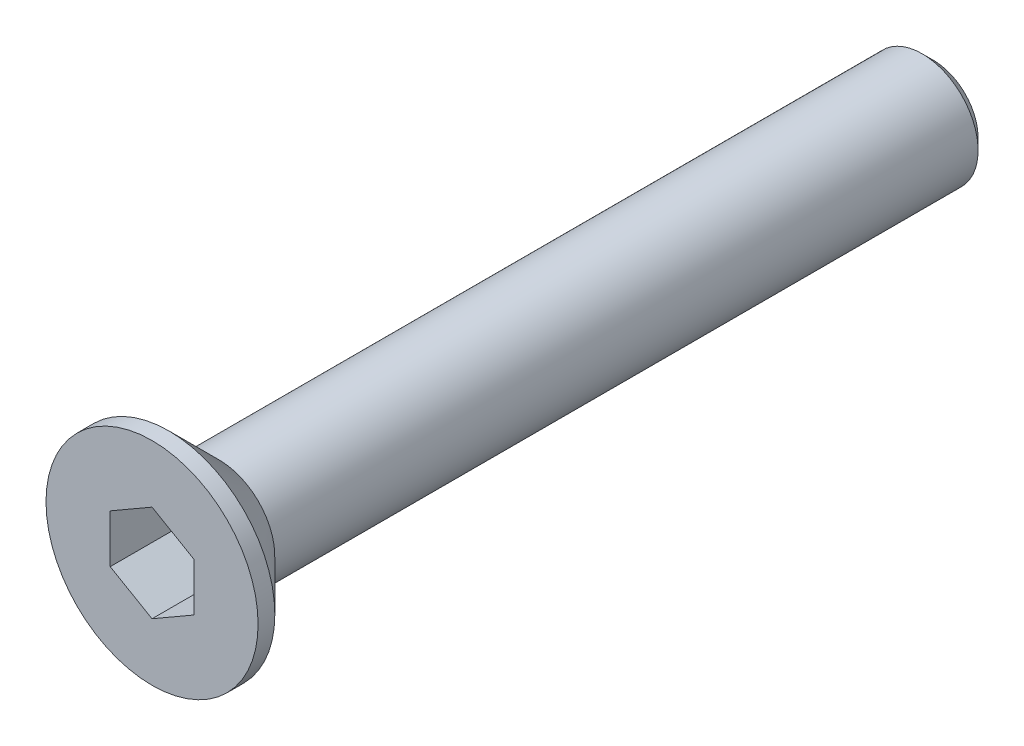
ISO-10303-21;
HEADER;
FILE_DESCRIPTION(('STEP AP214'),'2;1');
FILE_NAME('part.step','',(''),(''),'','','');
FILE_SCHEMA(('AUTOMOTIVE_DESIGN { 1 0 10303 214 1 1 1 1 }'));
ENDSEC;
DATA;
#1=APPLICATION_CONTEXT('core data for automotive mechanical design processes');
#2=APPLICATION_PROTOCOL_DEFINITION('international standard','automotive_design',2000,#1);
#3=PRODUCT_CONTEXT('',#1,'mechanical');
#4=PRODUCT('Part','Part','',(#3));
#5=PRODUCT_RELATED_PRODUCT_CATEGORY('part','',(#4));
#6=PRODUCT_DEFINITION_FORMATION('','',#4);
#7=PRODUCT_DEFINITION_CONTEXT('part definition',#1,'design');
#8=PRODUCT_DEFINITION('design','',#6,#7);
#9=PRODUCT_DEFINITION_SHAPE('','',#8);
#10=(LENGTH_UNIT() NAMED_UNIT(*) SI_UNIT(.MILLI.,.METRE.));
#11=(NAMED_UNIT(*) PLANE_ANGLE_UNIT() SI_UNIT($,.RADIAN.));
#12=(NAMED_UNIT(*) SI_UNIT($,.STERADIAN.) SOLID_ANGLE_UNIT());
#13=UNCERTAINTY_MEASURE_WITH_UNIT(LENGTH_MEASURE(1.E-05),#10,'distance_accuracy_value','');
#14=(GEOMETRIC_REPRESENTATION_CONTEXT(3) GLOBAL_UNCERTAINTY_ASSIGNED_CONTEXT((#13)) GLOBAL_UNIT_ASSIGNED_CONTEXT((#10,
#11,#12)) REPRESENTATION_CONTEXT('',''));
#15=CARTESIAN_POINT('',(0.,0.,0.));
#16=DIRECTION('',(0.,0.,1.));
#17=DIRECTION('',(1.,0.,0.));
#18=AXIS2_PLACEMENT_3D('',#15,#16,#17);
#19=CARTESIAN_POINT('',(0.,0.,-7.));
#20=DIRECTION('',(0.,0.,-1.));
#21=DIRECTION('',(-1.,0.,0.));
#22=AXIS2_PLACEMENT_3D('',#19,#20,#21);
#23=CYLINDRICAL_SURFACE('',#22,1.9);
#24=CARTESIAN_POINT('',(0.,0.,7.));
#25=DIRECTION('',(0.,0.,-1.));
#26=DIRECTION('',(-1.,0.,0.));
#27=AXIS2_PLACEMENT_3D('',#24,#25,#26);
#28=CIRCLE('',#27,1.9);
#29=CARTESIAN_POINT('',(-1.9,0.,7.));
#30=VERTEX_POINT('',#29);
#31=EDGE_CURVE('E140',#30,#30,#28,.T.);
#32=ORIENTED_EDGE('',*,*,#31,.T.);
#33=EDGE_LOOP('',(#32));
#34=FACE_BOUND('',#33,.T.);
#35=CARTESIAN_POINT('',(0.,0.,6.7));
#36=DIRECTION('',(0.,0.,-1.));
#37=DIRECTION('',(-1.,0.,0.));
#38=AXIS2_PLACEMENT_3D('',#35,#36,#37);
#39=CIRCLE('',#38,1.9);
#40=CARTESIAN_POINT('',(-1.9,0.,6.7));
#41=VERTEX_POINT('',#40);
#42=EDGE_CURVE('E151',#41,#41,#39,.T.);
#43=ORIENTED_EDGE('',*,*,#42,.F.);
#44=EDGE_LOOP('',(#43));
#45=FACE_BOUND('',#44,.T.);
#46=ADVANCED_FACE('F37',(#34,#45),#23,.T.);
#47=CARTESIAN_POINT('',(0.,0.,5.8));
#48=DIRECTION('',(0.,0.,1.));
#49=DIRECTION('',(1.,0.,0.));
#50=AXIS2_PLACEMENT_3D('',#47,#48,#49);
#51=CONICAL_SURFACE('',#50,0.999999999999999,0.78539816339745);
#52=ORIENTED_EDGE('',*,*,#42,.T.);
#53=EDGE_LOOP('',(#52));
#54=FACE_BOUND('',#53,.T.);
#55=CARTESIAN_POINT('',(0.,0.,5.8));
#56=DIRECTION('',(0.,0.,-1.));
#57=DIRECTION('',(-1.,0.,0.));
#58=AXIS2_PLACEMENT_3D('',#55,#56,#57);
#59=CIRCLE('',#58,0.999999999999999);
#60=CARTESIAN_POINT('',(-0.999999999999999,0.,5.8));
#61=VERTEX_POINT('',#60);
#62=EDGE_CURVE('E148',#61,#61,#59,.T.);
#63=ORIENTED_EDGE('',*,*,#62,.F.);
#64=EDGE_LOOP('',(#63));
#65=FACE_BOUND('',#64,.T.);
#66=ADVANCED_FACE('F167',(#54,#65),#51,.T.);
#67=CARTESIAN_POINT('',(0.,0.,-7.));
#68=DIRECTION('',(0.,0.,-1.));
#69=DIRECTION('',(-1.,0.,0.));
#70=AXIS2_PLACEMENT_3D('',#67,#68,#69);
#71=CYLINDRICAL_SURFACE('',#70,0.999999999999999);
#72=CARTESIAN_POINT('',(0.,0.,-6.79999999999999));
#73=DIRECTION('',(0.,0.,-1.));
#74=DIRECTION('',(-1.,0.,0.));
#75=AXIS2_PLACEMENT_3D('',#72,#73,#74);
#76=CIRCLE('',#75,0.999999999999999);
#77=CARTESIAN_POINT('',(-0.999999999999999,0.,-6.79999999999999));
#78=VERTEX_POINT('',#77);
#79=EDGE_CURVE('E11',#78,#78,#76,.F.);
#80=ORIENTED_EDGE('',*,*,#79,.T.);
#81=EDGE_LOOP('',(#80));
#82=FACE_BOUND('',#81,.T.);
#83=ORIENTED_EDGE('',*,*,#62,.T.);
#84=EDGE_LOOP('',(#83));
#85=FACE_BOUND('',#84,.T.);
#86=ADVANCED_FACE('F172',(#82,#85),#71,.T.);
#87=CARTESIAN_POINT('',(0.,0.999999999999999,-7.));
#88=DIRECTION('',(0.,0.,-1.));
#89=DIRECTION('',(-1.,0.,0.));
#90=AXIS2_PLACEMENT_3D('',#87,#88,#89);
#91=PLANE('',#90);
#92=CARTESIAN_POINT('',(0.,0.,-7.));
#93=DIRECTION('',(0.,0.,-1.));
#94=DIRECTION('',(-1.,0.,0.));
#95=AXIS2_PLACEMENT_3D('',#92,#93,#94);
#96=CIRCLE('',#95,0.799999999999993);
#97=CARTESIAN_POINT('',(-0.799999999999993,0.,-7.));
#98=VERTEX_POINT('',#97);
#99=EDGE_CURVE('E46',#98,#98,#96,.T.);
#100=ORIENTED_EDGE('',*,*,#99,.T.);
#101=EDGE_LOOP('',(#100));
#102=FACE_BOUND('',#101,.T.);
#103=ADVANCED_FACE('F156',(#102),#91,.T.);
#104=CARTESIAN_POINT('',(0.,0.,7.));
#105=DIRECTION('',(0.,0.,1.));
#106=DIRECTION('',(1.,0.,0.));
#107=AXIS2_PLACEMENT_3D('',#104,#105,#106);
#108=PLANE('',#107);
#109=DIRECTION('',(-0.866025403784439,0.5,0.));
#110=VECTOR('',#109,1.);
#111=CARTESIAN_POINT('',(0.75,0.43301270189222,7.));
#112=LINE('',#111,#110);
#113=CARTESIAN_POINT('',(0.75,0.43301270189222,7.));
#114=VERTEX_POINT('',#113);
#115=CARTESIAN_POINT('',(0.,0.866025403784439,7.));
#116=VERTEX_POINT('',#115);
#117=EDGE_CURVE('E53',#114,#116,#112,.T.);
#118=ORIENTED_EDGE('',*,*,#117,.F.);
#119=DIRECTION('',(0.,1.,0.));
#120=VECTOR('',#119,1.);
#121=CARTESIAN_POINT('',(0.75,-0.43301270189222,7.));
#122=LINE('',#121,#120);
#123=CARTESIAN_POINT('',(0.75,-0.43301270189222,7.));
#124=VERTEX_POINT('',#123);
#125=EDGE_CURVE('E136',#124,#114,#122,.T.);
#126=ORIENTED_EDGE('',*,*,#125,.F.);
#127=DIRECTION('',(0.866025403784439,0.5,0.));
#128=VECTOR('',#127,1.);
#129=CARTESIAN_POINT('',(0.,-0.866025403784439,7.));
#130=LINE('',#129,#128);
#131=CARTESIAN_POINT('',(0.,-0.866025403784439,7.));
#132=VERTEX_POINT('',#131);
#133=EDGE_CURVE('E134',#132,#124,#130,.T.);
#134=ORIENTED_EDGE('',*,*,#133,.F.);
#135=DIRECTION('',(0.866025403784439,-0.5,0.));
#136=VECTOR('',#135,1.);
#137=CARTESIAN_POINT('',(-0.75,-0.433012701892219,7.));
#138=LINE('',#137,#136);
#139=CARTESIAN_POINT('',(-0.75,-0.433012701892219,7.));
#140=VERTEX_POINT('',#139);
#141=EDGE_CURVE('E101',#140,#132,#138,.T.);
#142=ORIENTED_EDGE('',*,*,#141,.F.);
#143=DIRECTION('',(0.,-1.,0.));
#144=VECTOR('',#143,1.);
#145=CARTESIAN_POINT('',(-0.75,0.43301270189222,7.));
#146=LINE('',#145,#144);
#147=CARTESIAN_POINT('',(-0.75,0.43301270189222,7.));
#148=VERTEX_POINT('',#147);
#149=EDGE_CURVE('E130',#148,#140,#146,.T.);
#150=ORIENTED_EDGE('',*,*,#149,.F.);
#151=DIRECTION('',(-0.866025403784439,-0.5,0.));
#152=VECTOR('',#151,1.);
#153=CARTESIAN_POINT('',(0.,0.866025403784439,7.));
#154=LINE('',#153,#152);
#155=EDGE_CURVE('E127',#116,#148,#154,.T.);
#156=ORIENTED_EDGE('',*,*,#155,.F.);
#157=EDGE_LOOP('',(#118,#126,#134,#142,#150,#156));
#158=FACE_BOUND('',#157,.T.);
#159=ORIENTED_EDGE('',*,*,#31,.F.);
#160=EDGE_LOOP('',(#159));
#161=FACE_BOUND('',#160,.T.);
#162=ADVANCED_FACE('F182',(#158,#161),#108,.T.);
#163=CARTESIAN_POINT('',(0.75,0.43301270189222,5.5));
#164=DIRECTION('',(0.5,0.866025403784439,0.));
#165=DIRECTION('',(-0.866025403784439,0.5,0.));
#166=AXIS2_PLACEMENT_3D('',#163,#164,#165);
#167=PLANE('',#166);
#168=ORIENTED_EDGE('',*,*,#117,.T.);
#169=DIRECTION('',(0.,0.,1.));
#170=VECTOR('',#169,1.);
#171=CARTESIAN_POINT('',(0.,0.866025403784439,5.5));
#172=LINE('',#171,#170);
#173=CARTESIAN_POINT('',(0.,0.866025403784439,5.5));
#174=VERTEX_POINT('',#173);
#175=EDGE_CURVE('E83',#174,#116,#172,.T.);
#176=ORIENTED_EDGE('',*,*,#175,.F.);
#177=DIRECTION('',(-0.866025403784439,0.5,0.));
#178=VECTOR('',#177,1.);
#179=CARTESIAN_POINT('',(0.75,0.43301270189222,5.5));
#180=LINE('',#179,#178);
#181=CARTESIAN_POINT('',(0.75,0.43301270189222,5.5));
#182=VERTEX_POINT('',#181);
#183=EDGE_CURVE('E138',#182,#174,#180,.T.);
#184=ORIENTED_EDGE('',*,*,#183,.F.);
#185=DIRECTION('',(0.,0.,1.));
#186=VECTOR('',#185,1.);
#187=CARTESIAN_POINT('',(0.75,0.43301270189222,5.5));
#188=LINE('',#187,#186);
#189=EDGE_CURVE('E61',#182,#114,#188,.T.);
#190=ORIENTED_EDGE('',*,*,#189,.T.);
#191=EDGE_LOOP('',(#168,#176,#184,#190));
#192=FACE_BOUND('',#191,.T.);
#193=ADVANCED_FACE('F185',(#192),#167,.F.);
#194=CARTESIAN_POINT('',(0.75,-0.43301270189222,5.5));
#195=DIRECTION('',(1.,0.,0.));
#196=DIRECTION('',(0.,0.,-1.));
#197=AXIS2_PLACEMENT_3D('',#194,#195,#196);
#198=PLANE('',#197);
#199=ORIENTED_EDGE('',*,*,#125,.T.);
#200=ORIENTED_EDGE('',*,*,#189,.F.);
#201=DIRECTION('',(0.,1.,0.));
#202=VECTOR('',#201,1.);
#203=CARTESIAN_POINT('',(0.75,-0.43301270189222,5.5));
#204=LINE('',#203,#202);
#205=CARTESIAN_POINT('',(0.75,-0.43301270189222,5.5));
#206=VERTEX_POINT('',#205);
#207=EDGE_CURVE('E113',#206,#182,#204,.T.);
#208=ORIENTED_EDGE('',*,*,#207,.F.);
#209=DIRECTION('',(0.,0.,1.));
#210=VECTOR('',#209,1.);
#211=CARTESIAN_POINT('',(0.75,-0.43301270189222,5.5));
#212=LINE('',#211,#210);
#213=EDGE_CURVE('E105',#206,#124,#212,.T.);
#214=ORIENTED_EDGE('',*,*,#213,.T.);
#215=EDGE_LOOP('',(#199,#200,#208,#214));
#216=FACE_BOUND('',#215,.T.);
#217=ADVANCED_FACE('F189',(#216),#198,.F.);
#218=CARTESIAN_POINT('',(0.,-0.866025403784439,5.5));
#219=DIRECTION('',(0.5,-0.866025403784439,0.));
#220=DIRECTION('',(0.866025403784439,0.5,0.));
#221=AXIS2_PLACEMENT_3D('',#218,#219,#220);
#222=PLANE('',#221);
#223=ORIENTED_EDGE('',*,*,#133,.T.);
#224=ORIENTED_EDGE('',*,*,#213,.F.);
#225=DIRECTION('',(0.866025403784439,0.5,0.));
#226=VECTOR('',#225,1.);
#227=CARTESIAN_POINT('',(0.,-0.866025403784439,5.5));
#228=LINE('',#227,#226);
#229=CARTESIAN_POINT('',(0.,-0.866025403784439,5.5));
#230=VERTEX_POINT('',#229);
#231=EDGE_CURVE('E109',#230,#206,#228,.T.);
#232=ORIENTED_EDGE('',*,*,#231,.F.);
#233=DIRECTION('',(0.,0.,1.));
#234=VECTOR('',#233,1.);
#235=CARTESIAN_POINT('',(0.,-0.866025403784439,5.5));
#236=LINE('',#235,#234);
#237=EDGE_CURVE('E94',#230,#132,#236,.T.);
#238=ORIENTED_EDGE('',*,*,#237,.T.);
#239=EDGE_LOOP('',(#223,#224,#232,#238));
#240=FACE_BOUND('',#239,.T.);
#241=ADVANCED_FACE('F110',(#240),#222,.F.);
#242=CARTESIAN_POINT('',(-0.75,-0.433012701892219,5.5));
#243=DIRECTION('',(-0.5,-0.866025403784438,0.));
#244=DIRECTION('',(0.866025403784439,-0.5,0.));
#245=AXIS2_PLACEMENT_3D('',#242,#243,#244);
#246=PLANE('',#245);
#247=ORIENTED_EDGE('',*,*,#141,.T.);
#248=ORIENTED_EDGE('',*,*,#237,.F.);
#249=DIRECTION('',(0.866025403784439,-0.5,0.));
#250=VECTOR('',#249,1.);
#251=CARTESIAN_POINT('',(-0.75,-0.433012701892219,5.5));
#252=LINE('',#251,#250);
#253=CARTESIAN_POINT('',(-0.75,-0.433012701892219,5.5));
#254=VERTEX_POINT('',#253);
#255=EDGE_CURVE('E98',#254,#230,#252,.T.);
#256=ORIENTED_EDGE('',*,*,#255,.F.);
#257=DIRECTION('',(0.,0.,1.));
#258=VECTOR('',#257,1.);
#259=CARTESIAN_POINT('',(-0.75,-0.433012701892219,5.5));
#260=LINE('',#259,#258);
#261=EDGE_CURVE('E106',#254,#140,#260,.T.);
#262=ORIENTED_EDGE('',*,*,#261,.T.);
#263=EDGE_LOOP('',(#247,#248,#256,#262));
#264=FACE_BOUND('',#263,.T.);
#265=ADVANCED_FACE('F96',(#264),#246,.F.);
#266=CARTESIAN_POINT('',(-0.75,0.43301270189222,5.5));
#267=DIRECTION('',(-1.,0.,0.));
#268=DIRECTION('',(0.,0.,1.));
#269=AXIS2_PLACEMENT_3D('',#266,#267,#268);
#270=PLANE('',#269);
#271=ORIENTED_EDGE('',*,*,#149,.T.);
#272=ORIENTED_EDGE('',*,*,#261,.F.);
#273=DIRECTION('',(0.,-1.,0.));
#274=VECTOR('',#273,1.);
#275=CARTESIAN_POINT('',(-0.75,0.43301270189222,5.5));
#276=LINE('',#275,#274);
#277=CARTESIAN_POINT('',(-0.75,0.43301270189222,5.5));
#278=VERTEX_POINT('',#277);
#279=EDGE_CURVE('E119',#278,#254,#276,.T.);
#280=ORIENTED_EDGE('',*,*,#279,.F.);
#281=DIRECTION('',(0.,0.,1.));
#282=VECTOR('',#281,1.);
#283=CARTESIAN_POINT('',(-0.75,0.43301270189222,5.5));
#284=LINE('',#283,#282);
#285=EDGE_CURVE('E143',#278,#148,#284,.T.);
#286=ORIENTED_EDGE('',*,*,#285,.T.);
#287=EDGE_LOOP('',(#271,#272,#280,#286));
#288=FACE_BOUND('',#287,.T.);
#289=ADVANCED_FACE('F192',(#288),#270,.F.);
#290=CARTESIAN_POINT('',(0.,0.866025403784439,5.5));
#291=DIRECTION('',(-0.5,0.866025403784439,0.));
#292=DIRECTION('',(-0.866025403784439,-0.5,0.));
#293=AXIS2_PLACEMENT_3D('',#290,#291,#292);
#294=PLANE('',#293);
#295=ORIENTED_EDGE('',*,*,#155,.T.);
#296=ORIENTED_EDGE('',*,*,#285,.F.);
#297=DIRECTION('',(-0.866025403784439,-0.5,0.));
#298=VECTOR('',#297,1.);
#299=CARTESIAN_POINT('',(0.,0.866025403784439,5.5));
#300=LINE('',#299,#298);
#301=EDGE_CURVE('E121',#174,#278,#300,.T.);
#302=ORIENTED_EDGE('',*,*,#301,.F.);
#303=ORIENTED_EDGE('',*,*,#175,.T.);
#304=EDGE_LOOP('',(#295,#296,#302,#303));
#305=FACE_BOUND('',#304,.T.);
#306=ADVANCED_FACE('F163',(#305),#294,.F.);
#307=CARTESIAN_POINT('',(0.,0.,5.5));
#308=DIRECTION('',(0.,0.,1.));
#309=DIRECTION('',(1.,0.,0.));
#310=AXIS2_PLACEMENT_3D('',#307,#308,#309);
#311=PLANE('',#310);
#312=ORIENTED_EDGE('',*,*,#183,.T.);
#313=ORIENTED_EDGE('',*,*,#301,.T.);
#314=ORIENTED_EDGE('',*,*,#279,.T.);
#315=ORIENTED_EDGE('',*,*,#255,.T.);
#316=ORIENTED_EDGE('',*,*,#231,.T.);
#317=ORIENTED_EDGE('',*,*,#207,.T.);
#318=EDGE_LOOP('',(#312,#313,#314,#315,#316,#317));
#319=FACE_BOUND('',#318,.T.);
#320=ADVANCED_FACE('F116',(#319),#311,.T.);
#321=CARTESIAN_POINT('',(0.,0.,-7.));
#322=DIRECTION('',(0.,0.,1.));
#323=DIRECTION('',(1.,0.,0.));
#324=AXIS2_PLACEMENT_3D('',#321,#322,#323);
#325=CONICAL_SURFACE('',#324,0.799999999999993,0.785398163397445);
#326=ORIENTED_EDGE('',*,*,#79,.F.);
#327=EDGE_LOOP('',(#326));
#328=FACE_BOUND('',#327,.T.);
#329=ORIENTED_EDGE('',*,*,#99,.F.);
#330=EDGE_LOOP('',(#329));
#331=FACE_BOUND('',#330,.T.);
#332=ADVANCED_FACE('F40',(#328,#331),#325,.T.);
#333=CLOSED_SHELL('',(#46,#66,#86,#103,#162,#193,#217,#241,#265,#289,#306,#320,#332));
#334=MANIFOLD_SOLID_BREP('B2',#333);
#335=ADVANCED_BREP_SHAPE_REPRESENTATION('',(#18,#334),#14);
#336=SHAPE_DEFINITION_REPRESENTATION(#9,#335);
ENDSEC;
END-ISO-10303-21;
